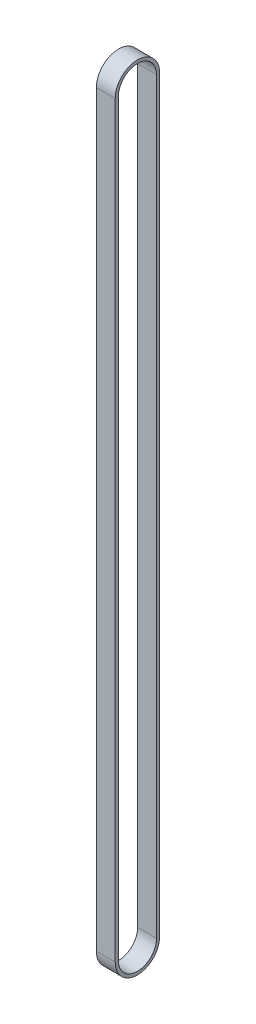
ISO-10303-21;
HEADER;
FILE_DESCRIPTION(('STEP AP214'),'2;1');
FILE_NAME('part.step','',(''),(''),'','','');
FILE_SCHEMA(('AUTOMOTIVE_DESIGN { 1 0 10303 214 1 1 1 1 }'));
ENDSEC;
DATA;
#1=APPLICATION_CONTEXT('core data for automotive mechanical design processes');
#2=APPLICATION_PROTOCOL_DEFINITION('international standard','automotive_design',2000,#1);
#3=PRODUCT_CONTEXT('',#1,'mechanical');
#4=PRODUCT('Part','Part','',(#3));
#5=PRODUCT_RELATED_PRODUCT_CATEGORY('part','',(#4));
#6=PRODUCT_DEFINITION_FORMATION('','',#4);
#7=PRODUCT_DEFINITION_CONTEXT('part definition',#1,'design');
#8=PRODUCT_DEFINITION('design','',#6,#7);
#9=PRODUCT_DEFINITION_SHAPE('','',#8);
#10=(LENGTH_UNIT() NAMED_UNIT(*) SI_UNIT(.MILLI.,.METRE.));
#11=(NAMED_UNIT(*) PLANE_ANGLE_UNIT() SI_UNIT($,.RADIAN.));
#12=(NAMED_UNIT(*) SI_UNIT($,.STERADIAN.) SOLID_ANGLE_UNIT());
#13=UNCERTAINTY_MEASURE_WITH_UNIT(LENGTH_MEASURE(1.E-05),#10,'distance_accuracy_value','');
#14=(GEOMETRIC_REPRESENTATION_CONTEXT(3) GLOBAL_UNCERTAINTY_ASSIGNED_CONTEXT((#13)) GLOBAL_UNIT_ASSIGNED_CONTEXT((#10,
#11,#12)) REPRESENTATION_CONTEXT('',''));
#15=CARTESIAN_POINT('',(0.,0.,0.));
#16=DIRECTION('',(0.,0.,1.));
#17=DIRECTION('',(1.,0.,0.));
#18=AXIS2_PLACEMENT_3D('',#15,#16,#17);
#19=CARTESIAN_POINT('',(6.05,-120.,0.));
#20=DIRECTION('',(1.,0.,0.));
#21=DIRECTION('',(0.,0.,-1.));
#22=AXIS2_PLACEMENT_3D('',#19,#20,#21);
#23=PLANE('',#22);
#24=CARTESIAN_POINT('',(6.05,-120.,0.));
#25=DIRECTION('',(1.,0.,0.));
#26=DIRECTION('',(0.,0.,-1.));
#27=AXIS2_PLACEMENT_3D('',#24,#25,#26);
#28=CIRCLE('',#27,7.12500000000004);
#29=CARTESIAN_POINT('',(6.05,-120.,7.12500000000004));
#30=VERTEX_POINT('',#29);
#31=CARTESIAN_POINT('',(6.05,-120.,-7.12500000000004));
#32=VERTEX_POINT('',#31);
#33=EDGE_CURVE('E157',#30,#32,#28,.T.);
#34=ORIENTED_EDGE('',*,*,#33,.T.);
#35=DIRECTION('',(0.,1.,0.));
#36=VECTOR('',#35,1.);
#37=CARTESIAN_POINT('',(6.05,-120.,-7.12500000000004));
#38=LINE('',#37,#36);
#39=CARTESIAN_POINT('',(6.05,120.,-7.12499999999996));
#40=VERTEX_POINT('',#39);
#41=EDGE_CURVE('E162',#32,#40,#38,.T.);
#42=ORIENTED_EDGE('',*,*,#41,.T.);
#43=CARTESIAN_POINT('',(6.05,120.,0.));
#44=DIRECTION('',(1.,0.,0.));
#45=DIRECTION('',(0.,0.,-1.));
#46=AXIS2_PLACEMENT_3D('',#43,#44,#45);
#47=CIRCLE('',#46,7.125);
#48=CARTESIAN_POINT('',(6.05,120.,7.12500000000004));
#49=VERTEX_POINT('',#48);
#50=EDGE_CURVE('E170',#40,#49,#47,.T.);
#51=ORIENTED_EDGE('',*,*,#50,.T.);
#52=DIRECTION('',(0.,-1.,0.));
#53=VECTOR('',#52,1.);
#54=CARTESIAN_POINT('',(6.05,-120.,7.12500000000004));
#55=LINE('',#54,#53);
#56=EDGE_CURVE('E168',#49,#30,#55,.T.);
#57=ORIENTED_EDGE('',*,*,#56,.T.);
#58=EDGE_LOOP('',(#34,#42,#51,#57));
#59=FACE_BOUND('',#58,.T.);
#60=DIRECTION('',(0.,1.,0.));
#61=VECTOR('',#60,1.);
#62=CARTESIAN_POINT('',(6.05,-120.,-6.12500000000005));
#63=LINE('',#62,#61);
#64=CARTESIAN_POINT('',(6.05,-120.,-6.12500000000005));
#65=VERTEX_POINT('',#64);
#66=CARTESIAN_POINT('',(6.05,120.,-6.125));
#67=VERTEX_POINT('',#66);
#68=EDGE_CURVE('E117',#65,#67,#63,.T.);
#69=ORIENTED_EDGE('',*,*,#68,.F.);
#70=CARTESIAN_POINT('',(6.05,-120.,0.));
#71=DIRECTION('',(1.,0.,0.));
#72=DIRECTION('',(0.,0.,-1.));
#73=AXIS2_PLACEMENT_3D('',#70,#71,#72);
#74=CIRCLE('',#73,6.12500000000005);
#75=CARTESIAN_POINT('',(6.05,-120.,6.12500000000005));
#76=VERTEX_POINT('',#75);
#77=EDGE_CURVE('E112',#76,#65,#74,.T.);
#78=ORIENTED_EDGE('',*,*,#77,.F.);
#79=DIRECTION('',(0.,-1.,0.));
#80=VECTOR('',#79,1.);
#81=CARTESIAN_POINT('',(6.05,-120.,6.12500000000005));
#82=LINE('',#81,#80);
#83=CARTESIAN_POINT('',(6.05,120.,6.12500000000009));
#84=VERTEX_POINT('',#83);
#85=EDGE_CURVE('E140',#84,#76,#82,.T.);
#86=ORIENTED_EDGE('',*,*,#85,.F.);
#87=CARTESIAN_POINT('',(6.05,120.,0.));
#88=DIRECTION('',(1.,0.,0.));
#89=DIRECTION('',(0.,0.,-1.));
#90=AXIS2_PLACEMENT_3D('',#87,#88,#89);
#91=CIRCLE('',#90,6.12500000000005);
#92=EDGE_CURVE('E131',#67,#84,#91,.T.);
#93=ORIENTED_EDGE('',*,*,#92,.F.);
#94=EDGE_LOOP('',(#69,#78,#86,#93));
#95=FACE_BOUND('',#94,.T.);
#96=ADVANCED_FACE('F44',(#59,#95),#23,.T.);
#97=CARTESIAN_POINT('',(0.,-120.,0.));
#98=DIRECTION('',(1.,0.,0.));
#99=DIRECTION('',(0.,0.,-1.));
#100=AXIS2_PLACEMENT_3D('',#97,#98,#99);
#101=PLANE('',#100);
#102=CARTESIAN_POINT('',(0.,-120.,0.));
#103=DIRECTION('',(1.,0.,0.));
#104=DIRECTION('',(0.,0.,-1.));
#105=AXIS2_PLACEMENT_3D('',#102,#103,#104);
#106=CIRCLE('',#105,7.12500000000004);
#107=CARTESIAN_POINT('',(0.,-120.,7.12500000000004));
#108=VERTEX_POINT('',#107);
#109=CARTESIAN_POINT('',(0.,-120.,-7.12500000000004));
#110=VERTEX_POINT('',#109);
#111=EDGE_CURVE('E129',#108,#110,#106,.T.);
#112=ORIENTED_EDGE('',*,*,#111,.F.);
#113=DIRECTION('',(0.,-1.,0.));
#114=VECTOR('',#113,1.);
#115=CARTESIAN_POINT('',(0.,-120.,7.12500000000004));
#116=LINE('',#115,#114);
#117=CARTESIAN_POINT('',(0.,120.,7.12500000000004));
#118=VERTEX_POINT('',#117);
#119=EDGE_CURVE('E163',#118,#108,#116,.T.);
#120=ORIENTED_EDGE('',*,*,#119,.F.);
#121=CARTESIAN_POINT('',(0.,120.,0.));
#122=DIRECTION('',(1.,0.,0.));
#123=DIRECTION('',(0.,0.,-1.));
#124=AXIS2_PLACEMENT_3D('',#121,#122,#123);
#125=CIRCLE('',#124,7.125);
#126=CARTESIAN_POINT('',(0.,120.,-7.12499999999996));
#127=VERTEX_POINT('',#126);
#128=EDGE_CURVE('E177',#127,#118,#125,.T.);
#129=ORIENTED_EDGE('',*,*,#128,.F.);
#130=DIRECTION('',(0.,1.,0.));
#131=VECTOR('',#130,1.);
#132=CARTESIAN_POINT('',(0.,-120.,-7.12500000000004));
#133=LINE('',#132,#131);
#134=EDGE_CURVE('E180',#110,#127,#133,.T.);
#135=ORIENTED_EDGE('',*,*,#134,.F.);
#136=EDGE_LOOP('',(#112,#120,#129,#135));
#137=FACE_BOUND('',#136,.T.);
#138=CARTESIAN_POINT('',(0.,-120.,0.));
#139=DIRECTION('',(1.,0.,0.));
#140=DIRECTION('',(0.,0.,-1.));
#141=AXIS2_PLACEMENT_3D('',#138,#139,#140);
#142=CIRCLE('',#141,6.12500000000005);
#143=CARTESIAN_POINT('',(0.,-120.,6.12500000000005));
#144=VERTEX_POINT('',#143);
#145=CARTESIAN_POINT('',(0.,-120.,-6.12500000000005));
#146=VERTEX_POINT('',#145);
#147=EDGE_CURVE('E69',#144,#146,#142,.T.);
#148=ORIENTED_EDGE('',*,*,#147,.T.);
#149=DIRECTION('',(0.,1.,0.));
#150=VECTOR('',#149,1.);
#151=CARTESIAN_POINT('',(0.,-120.,-6.12500000000005));
#152=LINE('',#151,#150);
#153=CARTESIAN_POINT('',(0.,120.,-6.125));
#154=VERTEX_POINT('',#153);
#155=EDGE_CURVE('E130',#146,#154,#152,.T.);
#156=ORIENTED_EDGE('',*,*,#155,.T.);
#157=CARTESIAN_POINT('',(0.,120.,0.));
#158=DIRECTION('',(1.,0.,0.));
#159=DIRECTION('',(0.,0.,-1.));
#160=AXIS2_PLACEMENT_3D('',#157,#158,#159);
#161=CIRCLE('',#160,6.12500000000005);
#162=CARTESIAN_POINT('',(0.,120.,6.12500000000009));
#163=VERTEX_POINT('',#162);
#164=EDGE_CURVE('E148',#154,#163,#161,.T.);
#165=ORIENTED_EDGE('',*,*,#164,.T.);
#166=DIRECTION('',(0.,-1.,0.));
#167=VECTOR('',#166,1.);
#168=CARTESIAN_POINT('',(0.,-120.,6.12500000000005));
#169=LINE('',#168,#167);
#170=EDGE_CURVE('E123',#163,#144,#169,.T.);
#171=ORIENTED_EDGE('',*,*,#170,.T.);
#172=EDGE_LOOP('',(#148,#156,#165,#171));
#173=FACE_BOUND('',#172,.T.);
#174=ADVANCED_FACE('F201',(#137,#173),#101,.F.);
#175=CARTESIAN_POINT('',(6.05,-120.,0.));
#176=DIRECTION('',(-1.,0.,0.));
#177=DIRECTION('',(0.,0.,1.));
#178=AXIS2_PLACEMENT_3D('',#175,#176,#177);
#179=CYLINDRICAL_SURFACE('',#178,7.12500000000004);
#180=ORIENTED_EDGE('',*,*,#111,.T.);
#181=DIRECTION('',(-1.,0.,0.));
#182=VECTOR('',#181,1.);
#183=CARTESIAN_POINT('',(6.05,-120.,-7.12500000000004));
#184=LINE('',#183,#182);
#185=EDGE_CURVE('E11',#32,#110,#184,.T.);
#186=ORIENTED_EDGE('',*,*,#185,.F.);
#187=ORIENTED_EDGE('',*,*,#33,.F.);
#188=DIRECTION('',(-1.,0.,0.));
#189=VECTOR('',#188,1.);
#190=CARTESIAN_POINT('',(6.05,-120.,7.12500000000004));
#191=LINE('',#190,#189);
#192=EDGE_CURVE('E171',#30,#108,#191,.T.);
#193=ORIENTED_EDGE('',*,*,#192,.T.);
#194=EDGE_LOOP('',(#180,#186,#187,#193));
#195=FACE_BOUND('',#194,.T.);
#196=ADVANCED_FACE('F50',(#195),#179,.T.);
#197=CARTESIAN_POINT('',(6.05,-120.,-7.12500000000004));
#198=DIRECTION('',(0.,0.,1.));
#199=DIRECTION('',(0.,-1.,0.));
#200=AXIS2_PLACEMENT_3D('',#197,#198,#199);
#201=PLANE('',#200);
#202=ORIENTED_EDGE('',*,*,#134,.T.);
#203=DIRECTION('',(-1.,0.,0.));
#204=VECTOR('',#203,1.);
#205=CARTESIAN_POINT('',(6.05,120.,-7.12499999999996));
#206=LINE('',#205,#204);
#207=EDGE_CURVE('E53',#40,#127,#206,.T.);
#208=ORIENTED_EDGE('',*,*,#207,.F.);
#209=ORIENTED_EDGE('',*,*,#41,.F.);
#210=ORIENTED_EDGE('',*,*,#185,.T.);
#211=EDGE_LOOP('',(#202,#208,#209,#210));
#212=FACE_BOUND('',#211,.T.);
#213=ADVANCED_FACE('F213',(#212),#201,.F.);
#214=CARTESIAN_POINT('',(6.05,120.,0.));
#215=DIRECTION('',(-1.,0.,0.));
#216=DIRECTION('',(0.,0.,1.));
#217=AXIS2_PLACEMENT_3D('',#214,#215,#216);
#218=CYLINDRICAL_SURFACE('',#217,7.125);
#219=ORIENTED_EDGE('',*,*,#128,.T.);
#220=DIRECTION('',(-1.,0.,0.));
#221=VECTOR('',#220,1.);
#222=CARTESIAN_POINT('',(6.05,120.,7.12500000000004));
#223=LINE('',#222,#221);
#224=EDGE_CURVE('E186',#49,#118,#223,.T.);
#225=ORIENTED_EDGE('',*,*,#224,.F.);
#226=ORIENTED_EDGE('',*,*,#50,.F.);
#227=ORIENTED_EDGE('',*,*,#207,.T.);
#228=EDGE_LOOP('',(#219,#225,#226,#227));
#229=FACE_BOUND('',#228,.T.);
#230=ADVANCED_FACE('F197',(#229),#218,.T.);
#231=CARTESIAN_POINT('',(6.05,-120.,7.12500000000004));
#232=DIRECTION('',(0.,0.,-1.));
#233=DIRECTION('',(-1.,0.,0.));
#234=AXIS2_PLACEMENT_3D('',#231,#232,#233);
#235=PLANE('',#234);
#236=ORIENTED_EDGE('',*,*,#119,.T.);
#237=ORIENTED_EDGE('',*,*,#192,.F.);
#238=ORIENTED_EDGE('',*,*,#56,.F.);
#239=ORIENTED_EDGE('',*,*,#224,.T.);
#240=EDGE_LOOP('',(#236,#237,#238,#239));
#241=FACE_BOUND('',#240,.T.);
#242=ADVANCED_FACE('F210',(#241),#235,.F.);
#243=CARTESIAN_POINT('',(6.05,-120.,0.));
#244=DIRECTION('',(-1.,0.,0.));
#245=DIRECTION('',(0.,0.,1.));
#246=AXIS2_PLACEMENT_3D('',#243,#244,#245);
#247=CYLINDRICAL_SURFACE('',#246,6.12500000000005);
#248=ORIENTED_EDGE('',*,*,#147,.F.);
#249=DIRECTION('',(-1.,0.,0.));
#250=VECTOR('',#249,1.);
#251=CARTESIAN_POINT('',(6.05,-120.,6.12500000000005));
#252=LINE('',#251,#250);
#253=EDGE_CURVE('E113',#76,#144,#252,.T.);
#254=ORIENTED_EDGE('',*,*,#253,.F.);
#255=ORIENTED_EDGE('',*,*,#77,.T.);
#256=DIRECTION('',(-1.,0.,0.));
#257=VECTOR('',#256,1.);
#258=CARTESIAN_POINT('',(6.05,-120.,-6.12500000000005));
#259=LINE('',#258,#257);
#260=EDGE_CURVE('E111',#65,#146,#259,.T.);
#261=ORIENTED_EDGE('',*,*,#260,.T.);
#262=EDGE_LOOP('',(#248,#254,#255,#261));
#263=FACE_BOUND('',#262,.T.);
#264=ADVANCED_FACE('F114',(#263),#247,.F.);
#265=CARTESIAN_POINT('',(6.05,-120.,-6.12500000000005));
#266=DIRECTION('',(0.,0.,1.));
#267=DIRECTION('',(0.,-1.,0.));
#268=AXIS2_PLACEMENT_3D('',#265,#266,#267);
#269=PLANE('',#268);
#270=ORIENTED_EDGE('',*,*,#155,.F.);
#271=ORIENTED_EDGE('',*,*,#260,.F.);
#272=ORIENTED_EDGE('',*,*,#68,.T.);
#273=DIRECTION('',(-1.,0.,0.));
#274=VECTOR('',#273,1.);
#275=CARTESIAN_POINT('',(6.05,120.,-6.125));
#276=LINE('',#275,#274);
#277=EDGE_CURVE('E128',#67,#154,#276,.T.);
#278=ORIENTED_EDGE('',*,*,#277,.T.);
#279=EDGE_LOOP('',(#270,#271,#272,#278));
#280=FACE_BOUND('',#279,.T.);
#281=ADVANCED_FACE('F124',(#280),#269,.T.);
#282=CARTESIAN_POINT('',(6.05,120.,0.));
#283=DIRECTION('',(-1.,0.,0.));
#284=DIRECTION('',(0.,0.,1.));
#285=AXIS2_PLACEMENT_3D('',#282,#283,#284);
#286=CYLINDRICAL_SURFACE('',#285,6.12500000000005);
#287=ORIENTED_EDGE('',*,*,#164,.F.);
#288=ORIENTED_EDGE('',*,*,#277,.F.);
#289=ORIENTED_EDGE('',*,*,#92,.T.);
#290=DIRECTION('',(-1.,0.,0.));
#291=VECTOR('',#290,1.);
#292=CARTESIAN_POINT('',(6.05,120.,6.12500000000009));
#293=LINE('',#292,#291);
#294=EDGE_CURVE('E63',#84,#163,#293,.T.);
#295=ORIENTED_EDGE('',*,*,#294,.T.);
#296=EDGE_LOOP('',(#287,#288,#289,#295));
#297=FACE_BOUND('',#296,.T.);
#298=ADVANCED_FACE('F237',(#297),#286,.F.);
#299=CARTESIAN_POINT('',(6.05,-120.,6.12500000000005));
#300=DIRECTION('',(0.,0.,-1.));
#301=DIRECTION('',(0.,1.,0.));
#302=AXIS2_PLACEMENT_3D('',#299,#300,#301);
#303=PLANE('',#302);
#304=ORIENTED_EDGE('',*,*,#170,.F.);
#305=ORIENTED_EDGE('',*,*,#294,.F.);
#306=ORIENTED_EDGE('',*,*,#85,.T.);
#307=ORIENTED_EDGE('',*,*,#253,.T.);
#308=EDGE_LOOP('',(#304,#305,#306,#307));
#309=FACE_BOUND('',#308,.T.);
#310=ADVANCED_FACE('F238',(#309),#303,.T.);
#311=CLOSED_SHELL('',(#96,#174,#196,#213,#230,#242,#264,#281,#298,#310));
#312=MANIFOLD_SOLID_BREP('B2',#311);
#313=ADVANCED_BREP_SHAPE_REPRESENTATION('',(#18,#312),#14);
#314=SHAPE_DEFINITION_REPRESENTATION(#9,#313);
ENDSEC;
END-ISO-10303-21;
